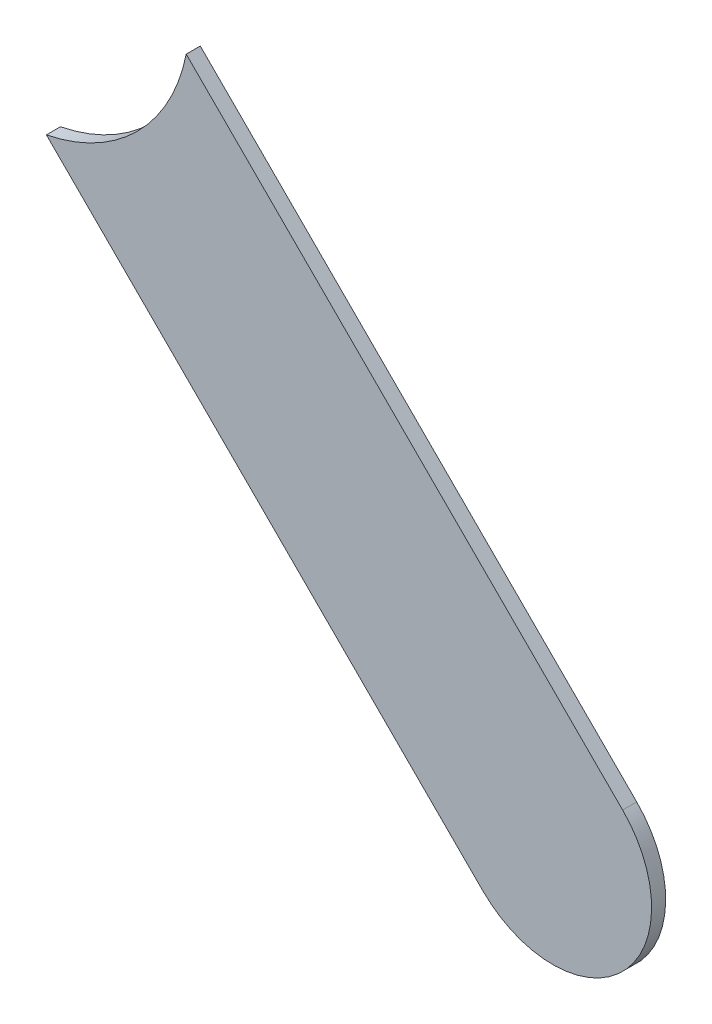
ISO-10303-21;
HEADER;
FILE_DESCRIPTION(('STEP AP214'),'2;1');
FILE_NAME('part.step','',(''),(''),'','','');
FILE_SCHEMA(('AUTOMOTIVE_DESIGN { 1 0 10303 214 1 1 1 1 }'));
ENDSEC;
DATA;
#1=APPLICATION_CONTEXT('core data for automotive mechanical design processes');
#2=APPLICATION_PROTOCOL_DEFINITION('international standard','automotive_design',2000,#1);
#3=PRODUCT_CONTEXT('',#1,'mechanical');
#4=PRODUCT('Part','Part','',(#3));
#5=PRODUCT_RELATED_PRODUCT_CATEGORY('part','',(#4));
#6=PRODUCT_DEFINITION_FORMATION('','',#4);
#7=PRODUCT_DEFINITION_CONTEXT('part definition',#1,'design');
#8=PRODUCT_DEFINITION('design','',#6,#7);
#9=PRODUCT_DEFINITION_SHAPE('','',#8);
#10=(LENGTH_UNIT() NAMED_UNIT(*) SI_UNIT(.MILLI.,.METRE.));
#11=(NAMED_UNIT(*) PLANE_ANGLE_UNIT() SI_UNIT($,.RADIAN.));
#12=(NAMED_UNIT(*) SI_UNIT($,.STERADIAN.) SOLID_ANGLE_UNIT());
#13=UNCERTAINTY_MEASURE_WITH_UNIT(LENGTH_MEASURE(1.E-05),#10,'distance_accuracy_value','');
#14=(GEOMETRIC_REPRESENTATION_CONTEXT(3) GLOBAL_UNCERTAINTY_ASSIGNED_CONTEXT((#13)) GLOBAL_UNIT_ASSIGNED_CONTEXT((#10,
#11,#12)) REPRESENTATION_CONTEXT('',''));
#15=CARTESIAN_POINT('',(0.,0.,0.));
#16=DIRECTION('',(0.,0.,1.));
#17=DIRECTION('',(1.,0.,0.));
#18=AXIS2_PLACEMENT_3D('',#15,#16,#17);
#19=CARTESIAN_POINT('',(50.7388017963948,106.426659843605,0.));
#20=DIRECTION('',(0.707106781186549,0.707106781186546,0.));
#21=DIRECTION('',(0.707106781186546,-0.707106781186549,0.));
#22=AXIS2_PLACEMENT_3D('',#19,#20,#21);
#23=PLANE('',#22);
#24=DIRECTION('',(0.707106781186546,-0.707106781186549,0.));
#25=VECTOR('',#24,1.);
#26=CARTESIAN_POINT('',(50.47422722,106.69123442,0.03556));
#27=LINE('',#26,#25);
#28=CARTESIAN_POINT('',(50.7388017963948,106.426659843605,0.03556));
#29=VERTEX_POINT('',#28);
#30=CARTESIAN_POINT('',(51.84222042,105.32324122,0.03556));
#31=VERTEX_POINT('',#30);
#32=EDGE_CURVE('E11',#29,#31,#27,.T.);
#33=ORIENTED_EDGE('',*,*,#32,.F.);
#34=DIRECTION('',(0.,0.,1.));
#35=VECTOR('',#34,1.);
#36=CARTESIAN_POINT('',(50.7388017963948,106.426659843605,0.));
#37=LINE('',#36,#35);
#38=CARTESIAN_POINT('',(50.7388017963948,106.426659843605,0.));
#39=VERTEX_POINT('',#38);
#40=EDGE_CURVE('E24',#39,#29,#37,.T.);
#41=ORIENTED_EDGE('',*,*,#40,.F.);
#42=DIRECTION('',(0.707106781186546,-0.707106781186549,0.));
#43=VECTOR('',#42,1.);
#44=CARTESIAN_POINT('',(50.47422722,106.69123442,0.));
#45=LINE('',#44,#43);
#46=CARTESIAN_POINT('',(51.84222042,105.32324122,0.));
#47=VERTEX_POINT('',#46);
#48=EDGE_CURVE('E75',#39,#47,#45,.T.);
#49=ORIENTED_EDGE('',*,*,#48,.T.);
#50=DIRECTION('',(0.,0.,1.));
#51=VECTOR('',#50,1.);
#52=CARTESIAN_POINT('',(51.84222042,105.32324122,0.));
#53=LINE('',#52,#51);
#54=EDGE_CURVE('E37',#47,#31,#53,.T.);
#55=ORIENTED_EDGE('',*,*,#54,.T.);
#56=EDGE_LOOP('',(#33,#41,#49,#55));
#57=FACE_BOUND('',#56,.T.);
#58=ADVANCED_FACE('F17',(#57),#23,.F.);
#59=CARTESIAN_POINT('',(52.0189968,105.5000176,0.));
#60=DIRECTION('',(0.,0.,-1.));
#61=DIRECTION('',(-0.707106781186533,-0.707106781186562,0.));
#62=AXIS2_PLACEMENT_3D('',#59,#60,#61);
#63=CYLINDRICAL_SURFACE('',#62,0.249999554103225);
#64=CARTESIAN_POINT('',(52.0189968,105.5000176,0.03556));
#65=DIRECTION('',(0.,0.,1.));
#66=DIRECTION('',(-0.707106781186533,-0.707106781186562,0.));
#67=AXIS2_PLACEMENT_3D('',#64,#65,#66);
#68=CIRCLE('',#67,0.249999554103225);
#69=CARTESIAN_POINT('',(52.19577318,105.67679398,0.03556));
#70=VERTEX_POINT('',#69);
#71=EDGE_CURVE('E83',#31,#70,#68,.T.);
#72=ORIENTED_EDGE('',*,*,#71,.F.);
#73=ORIENTED_EDGE('',*,*,#54,.F.);
#74=CARTESIAN_POINT('',(52.0189968,105.5000176,0.));
#75=DIRECTION('',(0.,0.,1.));
#76=DIRECTION('',(-0.707106781186533,-0.707106781186562,0.));
#77=AXIS2_PLACEMENT_3D('',#74,#75,#76);
#78=CIRCLE('',#77,0.249999554103225);
#79=CARTESIAN_POINT('',(52.19577318,105.67679398,0.));
#80=VERTEX_POINT('',#79);
#81=EDGE_CURVE('E81',#47,#80,#78,.T.);
#82=ORIENTED_EDGE('',*,*,#81,.T.);
#83=DIRECTION('',(0.,0.,1.));
#84=VECTOR('',#83,1.);
#85=CARTESIAN_POINT('',(52.19577318,105.67679398,0.));
#86=LINE('',#85,#84);
#87=EDGE_CURVE('E67',#80,#70,#86,.T.);
#88=ORIENTED_EDGE('',*,*,#87,.T.);
#89=EDGE_LOOP('',(#72,#73,#82,#88));
#90=FACE_BOUND('',#89,.T.);
#91=ADVANCED_FACE('F89',(#90),#63,.T.);
#92=CARTESIAN_POINT('',(52.19577318,105.67679398,0.));
#93=DIRECTION('',(-0.707106781186544,-0.707106781186551,0.));
#94=DIRECTION('',(-0.707106781186551,0.707106781186544,0.));
#95=AXIS2_PLACEMENT_3D('',#92,#93,#94);
#96=PLANE('',#95);
#97=DIRECTION('',(-0.707106781186551,0.707106781186544,0.));
#98=VECTOR('',#97,1.);
#99=CARTESIAN_POINT('',(52.19577318,105.67679398,0.03556));
#100=LINE('',#99,#98);
#101=CARTESIAN_POINT('',(51.0923545563948,106.780212603605,0.03556));
#102=VERTEX_POINT('',#101);
#103=EDGE_CURVE('E71',#70,#102,#100,.T.);
#104=ORIENTED_EDGE('',*,*,#103,.F.);
#105=ORIENTED_EDGE('',*,*,#87,.F.);
#106=DIRECTION('',(-0.707106781186551,0.707106781186544,0.));
#107=VECTOR('',#106,1.);
#108=CARTESIAN_POINT('',(52.19577318,105.67679398,0.));
#109=LINE('',#108,#107);
#110=CARTESIAN_POINT('',(51.0923545563948,106.780212603605,0.));
#111=VERTEX_POINT('',#110);
#112=EDGE_CURVE('E63',#80,#111,#109,.T.);
#113=ORIENTED_EDGE('',*,*,#112,.T.);
#114=DIRECTION('',(0.,0.,1.));
#115=VECTOR('',#114,1.);
#116=CARTESIAN_POINT('',(51.0923545563948,106.780212603605,0.));
#117=LINE('',#116,#115);
#118=EDGE_CURVE('E53',#111,#102,#117,.T.);
#119=ORIENTED_EDGE('',*,*,#118,.T.);
#120=EDGE_LOOP('',(#104,#105,#113,#119));
#121=FACE_BOUND('',#120,.T.);
#122=ADVANCED_FACE('F66',(#121),#96,.F.);
#123=CARTESIAN_POINT('',(50.6510036,106.8680108,0.));
#124=DIRECTION('',(0.,0.,-1.));
#125=DIRECTION('',(1.,0.,0.));
#126=AXIS2_PLACEMENT_3D('',#123,#124,#125);
#127=CYLINDRICAL_SURFACE('',#126,0.4499991);
#128=ORIENTED_EDGE('',*,*,#40,.T.);
#129=CARTESIAN_POINT('',(50.6510036,106.8680108,0.03556));
#130=DIRECTION('',(0.,0.,1.));
#131=DIRECTION('',(1.,0.,0.));
#132=AXIS2_PLACEMENT_3D('',#129,#130,#131);
#133=CIRCLE('',#132,0.4499991);
#134=EDGE_CURVE('E59',#29,#102,#133,.T.);
#135=ORIENTED_EDGE('',*,*,#134,.T.);
#136=ORIENTED_EDGE('',*,*,#118,.F.);
#137=CARTESIAN_POINT('',(50.6510036,106.8680108,0.));
#138=DIRECTION('',(0.,0.,1.));
#139=DIRECTION('',(1.,0.,0.));
#140=AXIS2_PLACEMENT_3D('',#137,#138,#139);
#141=CIRCLE('',#140,0.4499991);
#142=EDGE_CURVE('E57',#39,#111,#141,.T.);
#143=ORIENTED_EDGE('',*,*,#142,.F.);
#144=EDGE_LOOP('',(#128,#135,#136,#143));
#145=FACE_BOUND('',#144,.T.);
#146=ADVANCED_FACE('F55',(#145),#127,.F.);
#147=CARTESIAN_POINT('',(50.47422722,106.69123442,0.));
#148=DIRECTION('',(0.,0.,-1.));
#149=DIRECTION('',(-1.,0.,0.));
#150=AXIS2_PLACEMENT_3D('',#147,#148,#149);
#151=PLANE('',#150);
#152=ORIENTED_EDGE('',*,*,#48,.F.);
#153=ORIENTED_EDGE('',*,*,#142,.T.);
#154=ORIENTED_EDGE('',*,*,#112,.F.);
#155=ORIENTED_EDGE('',*,*,#81,.F.);
#156=EDGE_LOOP('',(#152,#153,#154,#155));
#157=FACE_BOUND('',#156,.T.);
#158=ADVANCED_FACE('F74',(#157),#151,.T.);
#159=CARTESIAN_POINT('',(50.47422722,106.69123442,0.03556));
#160=DIRECTION('',(0.,0.,-1.));
#161=DIRECTION('',(-1.,0.,0.));
#162=AXIS2_PLACEMENT_3D('',#159,#160,#161);
#163=PLANE('',#162);
#164=ORIENTED_EDGE('',*,*,#134,.F.);
#165=ORIENTED_EDGE('',*,*,#32,.T.);
#166=ORIENTED_EDGE('',*,*,#71,.T.);
#167=ORIENTED_EDGE('',*,*,#103,.T.);
#168=EDGE_LOOP('',(#164,#165,#166,#167));
#169=FACE_BOUND('',#168,.T.);
#170=ADVANCED_FACE('F91',(#169),#163,.F.);
#171=CLOSED_SHELL('',(#58,#91,#122,#146,#158,#170));
#172=MANIFOLD_SOLID_BREP('B1',#171);
#173=ADVANCED_BREP_SHAPE_REPRESENTATION('',(#18,#172),#14);
#174=SHAPE_DEFINITION_REPRESENTATION(#9,#173);
ENDSEC;
END-ISO-10303-21;
